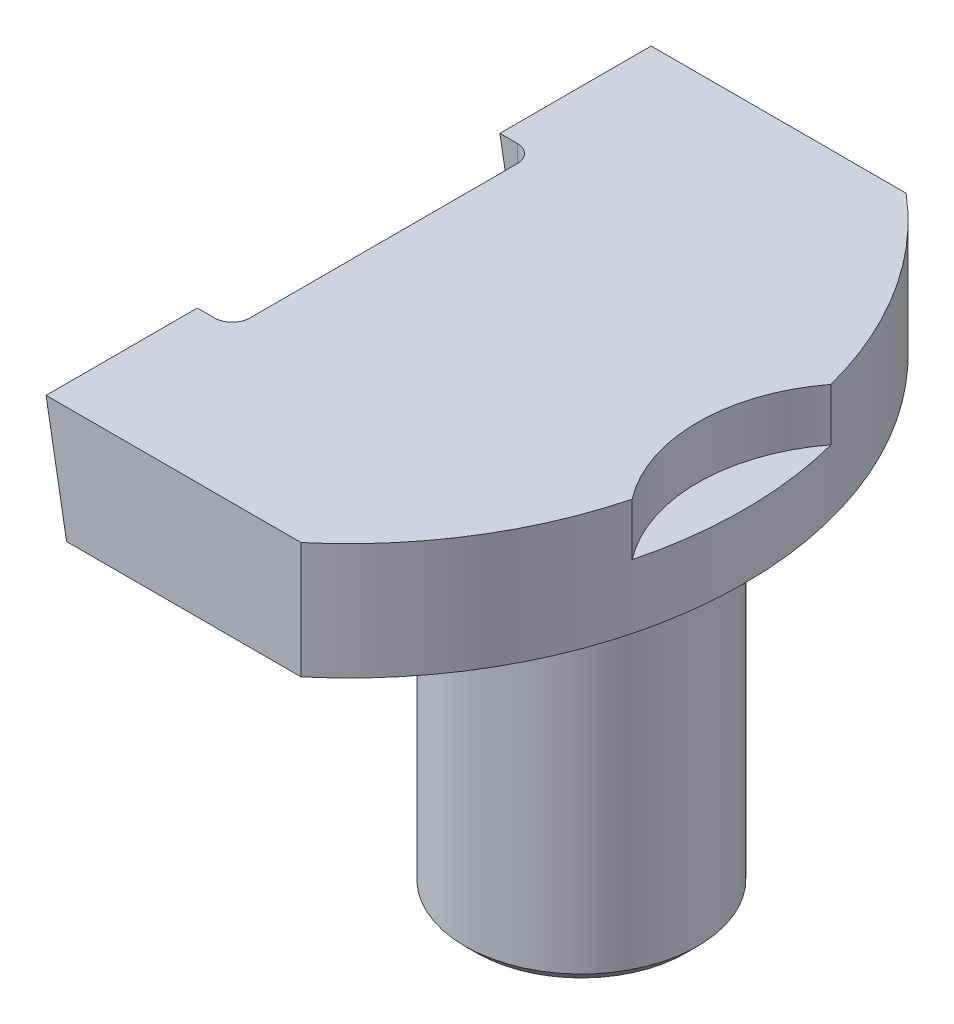
ISO-10303-21;
HEADER;
FILE_DESCRIPTION(('STEP AP214'),'2;1');
FILE_NAME('part.step','',(''),(''),'','','');
FILE_SCHEMA(('AUTOMOTIVE_DESIGN { 1 0 10303 214 1 1 1 1 }'));
ENDSEC;
DATA;
#1=APPLICATION_CONTEXT('core data for automotive mechanical design processes');
#2=APPLICATION_PROTOCOL_DEFINITION('international standard','automotive_design',2000,#1);
#3=PRODUCT_CONTEXT('',#1,'mechanical');
#4=PRODUCT('Part','Part','',(#3));
#5=PRODUCT_RELATED_PRODUCT_CATEGORY('part','',(#4));
#6=PRODUCT_DEFINITION_FORMATION('','',#4);
#7=PRODUCT_DEFINITION_CONTEXT('part definition',#1,'design');
#8=PRODUCT_DEFINITION('design','',#6,#7);
#9=PRODUCT_DEFINITION_SHAPE('','',#8);
#10=(LENGTH_UNIT() NAMED_UNIT(*) SI_UNIT(.MILLI.,.METRE.));
#11=(NAMED_UNIT(*) PLANE_ANGLE_UNIT() SI_UNIT($,.RADIAN.));
#12=(NAMED_UNIT(*) SI_UNIT($,.STERADIAN.) SOLID_ANGLE_UNIT());
#13=UNCERTAINTY_MEASURE_WITH_UNIT(LENGTH_MEASURE(1.E-05),#10,'distance_accuracy_value','');
#14=(GEOMETRIC_REPRESENTATION_CONTEXT(3) GLOBAL_UNCERTAINTY_ASSIGNED_CONTEXT((#13)) GLOBAL_UNIT_ASSIGNED_CONTEXT((#10,
#11,#12)) REPRESENTATION_CONTEXT('',''));
#15=CARTESIAN_POINT('',(0.,0.,0.));
#16=DIRECTION('',(0.,0.,1.));
#17=DIRECTION('',(1.,0.,0.));
#18=AXIS2_PLACEMENT_3D('',#15,#16,#17);
#19=CARTESIAN_POINT('',(0.,40.,0.));
#20=DIRECTION('',(0.,-1.,0.));
#21=DIRECTION('',(0.,0.,-1.));
#22=AXIS2_PLACEMENT_3D('',#19,#20,#21);
#23=CYLINDRICAL_SURFACE('',#22,10.);
#24=CARTESIAN_POINT('',(0.,28.,0.));
#25=DIRECTION('',(0.,-1.,0.));
#26=DIRECTION('',(0.,0.,-1.));
#27=AXIS2_PLACEMENT_3D('',#24,#25,#26);
#28=CIRCLE('',#27,10.);
#29=CARTESIAN_POINT('',(0.,28.,-10.));
#30=VERTEX_POINT('',#29);
#31=EDGE_CURVE('E148',#30,#30,#28,.T.);
#32=ORIENTED_EDGE('',*,*,#31,.T.);
#33=EDGE_LOOP('',(#32));
#34=FACE_BOUND('',#33,.T.);
#35=CARTESIAN_POINT('',(0.,1.,0.));
#36=DIRECTION('',(0.,1.,0.));
#37=DIRECTION('',(0.,0.,1.));
#38=AXIS2_PLACEMENT_3D('',#35,#36,#37);
#39=CIRCLE('',#38,10.);
#40=CARTESIAN_POINT('',(0.,1.,10.));
#41=VERTEX_POINT('',#40);
#42=EDGE_CURVE('E200',#41,#41,#39,.T.);
#43=ORIENTED_EDGE('',*,*,#42,.T.);
#44=EDGE_LOOP('',(#43));
#45=FACE_BOUND('',#44,.T.);
#46=ADVANCED_FACE('F42',(#34,#45),#23,.T.);
#47=CARTESIAN_POINT('',(0.,0.,0.));
#48=DIRECTION('',(0.,1.,0.));
#49=DIRECTION('',(0.,0.,1.));
#50=AXIS2_PLACEMENT_3D('',#47,#48,#49);
#51=PLANE('',#50);
#52=CARTESIAN_POINT('',(0.,0.,0.));
#53=DIRECTION('',(0.,1.,0.));
#54=DIRECTION('',(0.,0.,1.));
#55=AXIS2_PLACEMENT_3D('',#52,#53,#54);
#56=CIRCLE('',#55,9.);
#57=CARTESIAN_POINT('',(0.,0.,9.));
#58=VERTEX_POINT('',#57);
#59=EDGE_CURVE('E204',#58,#58,#56,.F.);
#60=ORIENTED_EDGE('',*,*,#59,.T.);
#61=EDGE_LOOP('',(#60));
#62=FACE_BOUND('',#61,.T.);
#63=ADVANCED_FACE('F287',(#62),#51,.F.);
#64=CARTESIAN_POINT('',(0.,1.,0.));
#65=DIRECTION('',(0.,1.,0.));
#66=DIRECTION('',(0.,0.,1.));
#67=AXIS2_PLACEMENT_3D('',#64,#65,#66);
#68=CONICAL_SURFACE('',#67,10.,0.785398163397449);
#69=ORIENTED_EDGE('',*,*,#59,.F.);
#70=EDGE_LOOP('',(#69));
#71=FACE_BOUND('',#70,.T.);
#72=ORIENTED_EDGE('',*,*,#42,.F.);
#73=EDGE_LOOP('',(#72));
#74=FACE_BOUND('',#73,.T.);
#75=ADVANCED_FACE('F294',(#71,#74),#68,.T.);
#76=CARTESIAN_POINT('',(-3.,28.,0.));
#77=DIRECTION('',(0.,-1.,0.));
#78=DIRECTION('',(0.,0.,-1.));
#79=AXIS2_PLACEMENT_3D('',#76,#77,#78);
#80=PLANE('',#79);
#81=CARTESIAN_POINT('',(0.,28.,0.));
#82=DIRECTION('',(0.,-1.,0.));
#83=DIRECTION('',(0.,0.,-1.));
#84=AXIS2_PLACEMENT_3D('',#81,#82,#83);
#85=CIRCLE('',#84,9.5);
#86=CARTESIAN_POINT('',(0.,28.,-9.5));
#87=VERTEX_POINT('',#86);
#88=EDGE_CURVE('E213',#87,#87,#85,.T.);
#89=ORIENTED_EDGE('',*,*,#88,.T.);
#90=EDGE_LOOP('',(#89));
#91=FACE_BOUND('',#90,.T.);
#92=ORIENTED_EDGE('',*,*,#31,.F.);
#93=EDGE_LOOP('',(#92));
#94=FACE_BOUND('',#93,.T.);
#95=ADVANCED_FACE('F264',(#91,#94),#80,.F.);
#96=CARTESIAN_POINT('',(0.,28.,0.));
#97=DIRECTION('',(0.,1.,0.));
#98=DIRECTION('',(0.,0.,1.));
#99=AXIS2_PLACEMENT_3D('',#96,#97,#98);
#100=CYLINDRICAL_SURFACE('',#99,9.5);
#101=ORIENTED_EDGE('',*,*,#88,.F.);
#102=EDGE_LOOP('',(#101));
#103=FACE_BOUND('',#102,.T.);
#104=CARTESIAN_POINT('',(0.,30.,0.));
#105=DIRECTION('',(0.,-1.,0.));
#106=DIRECTION('',(0.,0.,-1.));
#107=AXIS2_PLACEMENT_3D('',#104,#105,#106);
#108=CIRCLE('',#107,9.5);
#109=CARTESIAN_POINT('',(0.,30.,-9.5));
#110=VERTEX_POINT('',#109);
#111=EDGE_CURVE('E258',#110,#110,#108,.T.);
#112=ORIENTED_EDGE('',*,*,#111,.T.);
#113=EDGE_LOOP('',(#112));
#114=FACE_BOUND('',#113,.T.);
#115=ADVANCED_FACE('F267',(#103,#114),#100,.T.);
#116=CARTESIAN_POINT('',(24.,35.5,0.));
#117=DIRECTION('',(0.,1.,0.));
#118=DIRECTION('',(0.,0.,1.));
#119=AXIS2_PLACEMENT_3D('',#116,#117,#118);
#120=PLANE('',#119);
#121=CARTESIAN_POINT('',(24.,35.5,0.));
#122=DIRECTION('',(0.,1.,0.));
#123=DIRECTION('',(0.,0.,1.));
#124=AXIS2_PLACEMENT_3D('',#121,#122,#123);
#125=CIRCLE('',#124,14.);
#126=CARTESIAN_POINT('',(12.9090909090909,35.5,-8.54352009052418));
#127=VERTEX_POINT('',#126);
#128=CARTESIAN_POINT('',(12.9090909090909,35.5,8.54352009052418));
#129=VERTEX_POINT('',#128);
#130=EDGE_CURVE('E164',#127,#129,#125,.T.);
#131=ORIENTED_EDGE('',*,*,#130,.T.);
#132=CARTESIAN_POINT('',(-20.,35.5,0.));
#133=DIRECTION('',(0.,1.,0.));
#134=DIRECTION('',(0.,0.,1.));
#135=AXIS2_PLACEMENT_3D('',#132,#133,#134);
#136=CIRCLE('',#135,34.);
#137=EDGE_CURVE('E207',#127,#129,#136,.F.);
#138=ORIENTED_EDGE('',*,*,#137,.F.);
#139=EDGE_LOOP('',(#131,#138));
#140=FACE_BOUND('',#139,.T.);
#141=ADVANCED_FACE('F270',(#140),#120,.T.);
#142=CARTESIAN_POINT('',(24.,35.5,0.));
#143=DIRECTION('',(0.,1.,0.));
#144=DIRECTION('',(0.,0.,1.));
#145=AXIS2_PLACEMENT_3D('',#142,#143,#144);
#146=CYLINDRICAL_SURFACE('',#145,14.);
#147=DIRECTION('',(0.,1.,0.));
#148=VECTOR('',#147,1.);
#149=CARTESIAN_POINT('',(12.9090909090909,37.75,-8.54352009052418));
#150=LINE('',#149,#148);
#151=CARTESIAN_POINT('',(12.9090909090909,40.,-8.54352009052418));
#152=VERTEX_POINT('',#151);
#153=EDGE_CURVE('E170',#127,#152,#150,.T.);
#154=ORIENTED_EDGE('',*,*,#153,.T.);
#155=CARTESIAN_POINT('',(24.,40.,0.));
#156=DIRECTION('',(0.,1.,0.));
#157=DIRECTION('',(0.,0.,1.));
#158=AXIS2_PLACEMENT_3D('',#155,#156,#157);
#159=CIRCLE('',#158,14.);
#160=CARTESIAN_POINT('',(12.9090909090909,40.,8.54352009052418));
#161=VERTEX_POINT('',#160);
#162=EDGE_CURVE('E157',#152,#161,#159,.T.);
#163=ORIENTED_EDGE('',*,*,#162,.T.);
#164=DIRECTION('',(0.,1.,0.));
#165=VECTOR('',#164,1.);
#166=CARTESIAN_POINT('',(12.9090909090909,37.75,8.54352009052418));
#167=LINE('',#166,#165);
#168=EDGE_CURVE('E167',#161,#129,#167,.F.);
#169=ORIENTED_EDGE('',*,*,#168,.T.);
#170=ORIENTED_EDGE('',*,*,#130,.F.);
#171=EDGE_LOOP('',(#154,#163,#169,#170));
#172=FACE_BOUND('',#171,.T.);
#173=ADVANCED_FACE('F318',(#172),#146,.F.);
#174=CARTESIAN_POINT('',(0.,40.,0.));
#175=DIRECTION('',(0.,1.,0.));
#176=DIRECTION('',(0.,0.,1.));
#177=AXIS2_PLACEMENT_3D('',#174,#175,#176);
#178=PLANE('',#177);
#179=ORIENTED_EDGE('',*,*,#162,.F.);
#180=CARTESIAN_POINT('',(-20.,40.,0.));
#181=DIRECTION('',(0.,1.,0.));
#182=DIRECTION('',(0.,0.,-1.));
#183=AXIS2_PLACEMENT_3D('',#180,#181,#182);
#184=CIRCLE('',#183,34.);
#185=CARTESIAN_POINT('',(1.90890230020665,40.,-26.));
#186=VERTEX_POINT('',#185);
#187=EDGE_CURVE('E192',#152,#186,#184,.T.);
#188=ORIENTED_EDGE('',*,*,#187,.T.);
#189=DIRECTION('',(-1.,0.,0.));
#190=VECTOR('',#189,1.);
#191=CARTESIAN_POINT('',(-20.,40.,-26.));
#192=LINE('',#191,#190);
#193=CARTESIAN_POINT('',(-20.,40.,-26.));
#194=VERTEX_POINT('',#193);
#195=EDGE_CURVE('E196',#186,#194,#192,.T.);
#196=ORIENTED_EDGE('',*,*,#195,.T.);
#197=DIRECTION('',(0.,0.,1.));
#198=VECTOR('',#197,1.);
#199=CARTESIAN_POINT('',(-20.,40.,-13.));
#200=LINE('',#199,#198);
#201=CARTESIAN_POINT('',(-20.,40.,-13.));
#202=VERTEX_POINT('',#201);
#203=EDGE_CURVE('E153',#194,#202,#200,.T.);
#204=ORIENTED_EDGE('',*,*,#203,.T.);
#205=DIRECTION('',(1.,0.,0.));
#206=VECTOR('',#205,1.);
#207=CARTESIAN_POINT('',(-17.,40.,-13.));
#208=LINE('',#207,#206);
#209=CARTESIAN_POINT('',(-18.5,40.,-13.));
#210=VERTEX_POINT('',#209);
#211=EDGE_CURVE('E172',#202,#210,#208,.T.);
#212=ORIENTED_EDGE('',*,*,#211,.T.);
#213=CARTESIAN_POINT('',(-18.5,40.,-11.5));
#214=DIRECTION('',(0.,1.,0.));
#215=DIRECTION('',(0.,0.,1.));
#216=AXIS2_PLACEMENT_3D('',#213,#214,#215);
#217=CIRCLE('',#216,1.5);
#218=CARTESIAN_POINT('',(-17.,40.,-11.5));
#219=VERTEX_POINT('',#218);
#220=EDGE_CURVE('E229',#210,#219,#217,.F.);
#221=ORIENTED_EDGE('',*,*,#220,.T.);
#222=DIRECTION('',(0.,0.,1.));
#223=VECTOR('',#222,1.);
#224=CARTESIAN_POINT('',(-17.,40.,13.));
#225=LINE('',#224,#223);
#226=CARTESIAN_POINT('',(-17.,40.,11.5));
#227=VERTEX_POINT('',#226);
#228=EDGE_CURVE('E181',#219,#227,#225,.T.);
#229=ORIENTED_EDGE('',*,*,#228,.T.);
#230=CARTESIAN_POINT('',(-18.5,40.,11.5));
#231=DIRECTION('',(0.,1.,0.));
#232=DIRECTION('',(0.,0.,1.));
#233=AXIS2_PLACEMENT_3D('',#230,#231,#232);
#234=CIRCLE('',#233,1.5);
#235=CARTESIAN_POINT('',(-18.5,40.,13.));
#236=VERTEX_POINT('',#235);
#237=EDGE_CURVE('E223',#227,#236,#234,.F.);
#238=ORIENTED_EDGE('',*,*,#237,.T.);
#239=DIRECTION('',(-1.,0.,0.));
#240=VECTOR('',#239,1.);
#241=CARTESIAN_POINT('',(-17.,40.,13.));
#242=LINE('',#241,#240);
#243=CARTESIAN_POINT('',(-20.,40.,13.));
#244=VERTEX_POINT('',#243);
#245=EDGE_CURVE('E184',#236,#244,#242,.T.);
#246=ORIENTED_EDGE('',*,*,#245,.T.);
#247=DIRECTION('',(0.,0.,1.));
#248=VECTOR('',#247,1.);
#249=CARTESIAN_POINT('',(-20.,40.,13.));
#250=LINE('',#249,#248);
#251=CARTESIAN_POINT('',(-20.,40.,26.));
#252=VERTEX_POINT('',#251);
#253=EDGE_CURVE('E186',#244,#252,#250,.T.);
#254=ORIENTED_EDGE('',*,*,#253,.T.);
#255=DIRECTION('',(1.,0.,0.));
#256=VECTOR('',#255,1.);
#257=CARTESIAN_POINT('',(-20.,40.,26.));
#258=LINE('',#257,#256);
#259=CARTESIAN_POINT('',(1.90890230020665,40.,26.));
#260=VERTEX_POINT('',#259);
#261=EDGE_CURVE('E189',#252,#260,#258,.T.);
#262=ORIENTED_EDGE('',*,*,#261,.T.);
#263=EDGE_CURVE('E193',#260,#161,#184,.T.);
#264=ORIENTED_EDGE('',*,*,#263,.T.);
#265=EDGE_LOOP('',(#179,#188,#196,#204,#212,#221,#229,#238,#246,#254,#262,#264));
#266=FACE_BOUND('',#265,.T.);
#267=ADVANCED_FACE('F233',(#266),#178,.T.);
#268=CARTESIAN_POINT('',(-20.,30.,0.));
#269=DIRECTION('',(0.,1.,0.));
#270=DIRECTION('',(0.,0.,1.));
#271=AXIS2_PLACEMENT_3D('',#268,#269,#270);
#272=CYLINDRICAL_SURFACE('',#271,34.);
#273=ORIENTED_EDGE('',*,*,#153,.F.);
#274=ORIENTED_EDGE('',*,*,#137,.T.);
#275=ORIENTED_EDGE('',*,*,#168,.F.);
#276=ORIENTED_EDGE('',*,*,#263,.F.);
#277=DIRECTION('',(0.,1.,0.));
#278=VECTOR('',#277,1.);
#279=CARTESIAN_POINT('',(1.90890230020665,30.,26.));
#280=LINE('',#279,#278);
#281=CARTESIAN_POINT('',(1.90890230020665,30.,26.));
#282=VERTEX_POINT('',#281);
#283=EDGE_CURVE('E140',#282,#260,#280,.T.);
#284=ORIENTED_EDGE('',*,*,#283,.F.);
#285=CARTESIAN_POINT('',(-20.,30.,0.));
#286=DIRECTION('',(0.,1.,0.));
#287=DIRECTION('',(0.,0.,-1.));
#288=AXIS2_PLACEMENT_3D('',#285,#286,#287);
#289=CIRCLE('',#288,34.);
#290=CARTESIAN_POINT('',(1.90890230020665,30.,-26.));
#291=VERTEX_POINT('',#290);
#292=EDGE_CURVE('E141',#282,#291,#289,.T.);
#293=ORIENTED_EDGE('',*,*,#292,.T.);
#294=DIRECTION('',(0.,1.,0.));
#295=VECTOR('',#294,1.);
#296=CARTESIAN_POINT('',(1.90890230020665,30.,-26.));
#297=LINE('',#296,#295);
#298=EDGE_CURVE('E137',#291,#186,#297,.T.);
#299=ORIENTED_EDGE('',*,*,#298,.T.);
#300=ORIENTED_EDGE('',*,*,#187,.F.);
#301=EDGE_LOOP('',(#273,#274,#275,#276,#284,#293,#299,#300));
#302=FACE_BOUND('',#301,.T.);
#303=ADVANCED_FACE('F247',(#302),#272,.T.);
#304=CARTESIAN_POINT('',(-20.,30.,-26.));
#305=DIRECTION('',(0.,0.,-1.));
#306=DIRECTION('',(-1.,0.,0.));
#307=AXIS2_PLACEMENT_3D('',#304,#305,#306);
#308=PLANE('',#307);
#309=DIRECTION('',(0.173648177666924,-0.984807753012209,0.));
#310=VECTOR('',#309,1.);
#311=CARTESIAN_POINT('',(-18.2898992833717,30.3015368960704,-26.));
#312=LINE('',#311,#310);
#313=CARTESIAN_POINT('',(-18.2367301929154,30.,-26.));
#314=VERTEX_POINT('',#313);
#315=EDGE_CURVE('E134',#194,#314,#312,.T.);
#316=ORIENTED_EDGE('',*,*,#315,.F.);
#317=ORIENTED_EDGE('',*,*,#195,.F.);
#318=ORIENTED_EDGE('',*,*,#298,.F.);
#319=DIRECTION('',(-1.,0.,0.));
#320=VECTOR('',#319,1.);
#321=CARTESIAN_POINT('',(-20.,30.,-26.));
#322=LINE('',#321,#320);
#323=EDGE_CURVE('E131',#291,#314,#322,.T.);
#324=ORIENTED_EDGE('',*,*,#323,.T.);
#325=EDGE_LOOP('',(#316,#317,#318,#324));
#326=FACE_BOUND('',#325,.T.);
#327=ADVANCED_FACE('F132',(#326),#308,.T.);
#328=CARTESIAN_POINT('',(-20.,40.,163.364766009556));
#329=DIRECTION('',(0.984807753012209,0.173648177666924,0.));
#330=DIRECTION('',(-0.173648177666924,0.984807753012209,0.));
#331=AXIS2_PLACEMENT_3D('',#328,#329,#330);
#332=PLANE('',#331);
#333=DIRECTION('',(0.,0.,-1.));
#334=VECTOR('',#333,1.);
#335=CARTESIAN_POINT('',(-18.2367301929154,30.,163.364766009556));
#336=LINE('',#335,#334);
#337=CARTESIAN_POINT('',(-18.2367301929154,30.,-12.97671561537));
#338=VERTEX_POINT('',#337);
#339=EDGE_CURVE('E56',#338,#314,#336,.T.);
#340=ORIENTED_EDGE('',*,*,#339,.F.);
#341=CARTESIAN_POINT('',(-18.5,31.4930772705731,-11.5));
#342=DIRECTION('',(0.984807753012209,0.173648177666924,0.));
#343=DIRECTION('',(0.173648177666924,-0.984807753012209,0.));
#344=AXIS2_PLACEMENT_3D('',#341,#342,#343);
#345=ELLIPSE('',#344,8.63815572471578,1.5);
#346=CARTESIAN_POINT('',(-18.5,31.4930772705731,-13.));
#347=VERTEX_POINT('',#346);
#348=EDGE_CURVE('E12',#338,#347,#345,.T.);
#349=ORIENTED_EDGE('',*,*,#348,.T.);
#350=DIRECTION('',(-0.173648177666924,0.984807753012209,0.));
#351=VECTOR('',#350,1.);
#352=CARTESIAN_POINT('',(-18.1994382145506,29.788506681082,-13.));
#353=LINE('',#352,#351);
#354=EDGE_CURVE('E154',#347,#202,#353,.T.);
#355=ORIENTED_EDGE('',*,*,#354,.T.);
#356=ORIENTED_EDGE('',*,*,#203,.F.);
#357=ORIENTED_EDGE('',*,*,#315,.T.);
#358=EDGE_LOOP('',(#340,#349,#355,#356,#357));
#359=FACE_BOUND('',#358,.T.);
#360=ADVANCED_FACE('F151',(#359),#332,.F.);
#361=CARTESIAN_POINT('',(-17.,30.,-13.));
#362=DIRECTION('',(0.,0.,1.));
#363=DIRECTION('',(1.,0.,0.));
#364=AXIS2_PLACEMENT_3D('',#361,#362,#363);
#365=PLANE('',#364);
#366=ORIENTED_EDGE('',*,*,#354,.F.);
#367=DIRECTION('',(0.,1.,0.));
#368=VECTOR('',#367,1.);
#369=CARTESIAN_POINT('',(-18.5,40.,-13.));
#370=LINE('',#369,#368);
#371=EDGE_CURVE('E220',#347,#210,#370,.T.);
#372=ORIENTED_EDGE('',*,*,#371,.T.);
#373=ORIENTED_EDGE('',*,*,#211,.F.);
#374=EDGE_LOOP('',(#366,#372,#373));
#375=FACE_BOUND('',#374,.T.);
#376=ADVANCED_FACE('F243',(#375),#365,.T.);
#377=CARTESIAN_POINT('',(-17.,30.,13.));
#378=DIRECTION('',(-1.,0.,0.));
#379=DIRECTION('',(0.,0.,1.));
#380=AXIS2_PLACEMENT_3D('',#377,#378,#379);
#381=PLANE('',#380);
#382=DIRECTION('',(0.,0.,1.));
#383=VECTOR('',#382,1.);
#384=CARTESIAN_POINT('',(-17.,30.,13.));
#385=LINE('',#384,#383);
#386=CARTESIAN_POINT('',(-17.,30.,-11.5));
#387=VERTEX_POINT('',#386);
#388=CARTESIAN_POINT('',(-17.,30.,11.5));
#389=VERTEX_POINT('',#388);
#390=EDGE_CURVE('E173',#387,#389,#385,.T.);
#391=ORIENTED_EDGE('',*,*,#390,.T.);
#392=DIRECTION('',(0.,1.,0.));
#393=VECTOR('',#392,1.);
#394=CARTESIAN_POINT('',(-17.,40.,11.5));
#395=LINE('',#394,#393);
#396=EDGE_CURVE('E215',#389,#227,#395,.T.);
#397=ORIENTED_EDGE('',*,*,#396,.T.);
#398=ORIENTED_EDGE('',*,*,#228,.F.);
#399=DIRECTION('',(0.,1.,0.));
#400=VECTOR('',#399,1.);
#401=CARTESIAN_POINT('',(-17.,30.,-11.5));
#402=LINE('',#401,#400);
#403=EDGE_CURVE('E210',#219,#387,#402,.F.);
#404=ORIENTED_EDGE('',*,*,#403,.T.);
#405=EDGE_LOOP('',(#391,#397,#398,#404));
#406=FACE_BOUND('',#405,.T.);
#407=ADVANCED_FACE('F239',(#406),#381,.T.);
#408=CARTESIAN_POINT('',(-17.,30.,13.));
#409=DIRECTION('',(0.,0.,-1.));
#410=DIRECTION('',(-1.,0.,0.));
#411=AXIS2_PLACEMENT_3D('',#408,#409,#410);
#412=PLANE('',#411);
#413=ORIENTED_EDGE('',*,*,#245,.F.);
#414=DIRECTION('',(0.,1.,0.));
#415=VECTOR('',#414,1.);
#416=CARTESIAN_POINT('',(-18.5,30.,13.));
#417=LINE('',#416,#415);
#418=CARTESIAN_POINT('',(-18.5,31.4930772705731,13.));
#419=VERTEX_POINT('',#418);
#420=EDGE_CURVE('E218',#236,#419,#417,.F.);
#421=ORIENTED_EDGE('',*,*,#420,.T.);
#422=DIRECTION('',(0.173648177666924,-0.984807753012209,0.));
#423=VECTOR('',#422,1.);
#424=CARTESIAN_POINT('',(-18.1994382145506,29.788506681082,13.));
#425=LINE('',#424,#423);
#426=EDGE_CURVE('E160',#244,#419,#425,.T.);
#427=ORIENTED_EDGE('',*,*,#426,.F.);
#428=EDGE_LOOP('',(#413,#421,#427));
#429=FACE_BOUND('',#428,.T.);
#430=ADVANCED_FACE('F316',(#429),#412,.T.);
#431=CARTESIAN_POINT('',(-18.2367301929154,30.,26.));
#432=VERTEX_POINT('',#431);
#433=CARTESIAN_POINT('',(-18.2367301929154,30.,12.97671561537));
#434=VERTEX_POINT('',#433);
#435=EDGE_CURVE('E64',#432,#434,#336,.T.);
#436=ORIENTED_EDGE('',*,*,#435,.F.);
#437=DIRECTION('',(-0.173648177666924,0.984807753012209,0.));
#438=VECTOR('',#437,1.);
#439=CARTESIAN_POINT('',(-18.2898992833717,30.3015368960704,26.));
#440=LINE('',#439,#438);
#441=EDGE_CURVE('E155',#432,#252,#440,.T.);
#442=ORIENTED_EDGE('',*,*,#441,.T.);
#443=ORIENTED_EDGE('',*,*,#253,.F.);
#444=ORIENTED_EDGE('',*,*,#426,.T.);
#445=CARTESIAN_POINT('',(-18.5,31.4930772705731,11.5));
#446=DIRECTION('',(0.984807753012209,0.173648177666924,0.));
#447=DIRECTION('',(0.173648177666924,-0.984807753012209,0.));
#448=AXIS2_PLACEMENT_3D('',#445,#446,#447);
#449=ELLIPSE('',#448,8.63815572471578,1.5);
#450=EDGE_CURVE('E225',#419,#434,#449,.T.);
#451=ORIENTED_EDGE('',*,*,#450,.T.);
#452=EDGE_LOOP('',(#436,#442,#443,#444,#451));
#453=FACE_BOUND('',#452,.T.);
#454=ADVANCED_FACE('F252',(#453),#332,.F.);
#455=CARTESIAN_POINT('',(-20.,30.,26.));
#456=DIRECTION('',(0.,0.,1.));
#457=DIRECTION('',(1.,0.,0.));
#458=AXIS2_PLACEMENT_3D('',#455,#456,#457);
#459=PLANE('',#458);
#460=ORIENTED_EDGE('',*,*,#441,.F.);
#461=DIRECTION('',(1.,0.,0.));
#462=VECTOR('',#461,1.);
#463=CARTESIAN_POINT('',(-20.,30.,26.));
#464=LINE('',#463,#462);
#465=EDGE_CURVE('E176',#432,#282,#464,.T.);
#466=ORIENTED_EDGE('',*,*,#465,.T.);
#467=ORIENTED_EDGE('',*,*,#283,.T.);
#468=ORIENTED_EDGE('',*,*,#261,.F.);
#469=EDGE_LOOP('',(#460,#466,#467,#468));
#470=FACE_BOUND('',#469,.T.);
#471=ADVANCED_FACE('F275',(#470),#459,.T.);
#472=CARTESIAN_POINT('',(-20.,30.,0.));
#473=DIRECTION('',(0.,-1.,0.));
#474=DIRECTION('',(0.,0.,-1.));
#475=AXIS2_PLACEMENT_3D('',#472,#473,#474);
#476=PLANE('',#475);
#477=ORIENTED_EDGE('',*,*,#465,.F.);
#478=ORIENTED_EDGE('',*,*,#435,.T.);
#479=CARTESIAN_POINT('',(-18.5,30.,11.5));
#480=DIRECTION('',(0.,-1.,0.));
#481=DIRECTION('',(0.,0.,-1.));
#482=AXIS2_PLACEMENT_3D('',#479,#480,#481);
#483=CIRCLE('',#482,1.5);
#484=EDGE_CURVE('E227',#434,#389,#483,.F.);
#485=ORIENTED_EDGE('',*,*,#484,.T.);
#486=ORIENTED_EDGE('',*,*,#390,.F.);
#487=CARTESIAN_POINT('',(-18.5,30.,-11.5));
#488=DIRECTION('',(0.,-1.,0.));
#489=DIRECTION('',(0.,0.,-1.));
#490=AXIS2_PLACEMENT_3D('',#487,#488,#489);
#491=CIRCLE('',#490,1.5);
#492=EDGE_CURVE('E50',#387,#338,#491,.F.);
#493=ORIENTED_EDGE('',*,*,#492,.T.);
#494=ORIENTED_EDGE('',*,*,#339,.T.);
#495=ORIENTED_EDGE('',*,*,#323,.F.);
#496=ORIENTED_EDGE('',*,*,#292,.F.);
#497=EDGE_LOOP('',(#477,#478,#485,#486,#493,#494,#495,#496));
#498=FACE_BOUND('',#497,.T.);
#499=ORIENTED_EDGE('',*,*,#111,.F.);
#500=EDGE_LOOP('',(#499));
#501=FACE_BOUND('',#500,.T.);
#502=ADVANCED_FACE('F143',(#498,#501),#476,.T.);
#503=CARTESIAN_POINT('',(-18.5,30.,11.5));
#504=DIRECTION('',(0.,-1.,0.));
#505=DIRECTION('',(0.,0.,-1.));
#506=AXIS2_PLACEMENT_3D('',#503,#504,#505);
#507=CYLINDRICAL_SURFACE('',#506,1.5);
#508=ORIENTED_EDGE('',*,*,#450,.F.);
#509=ORIENTED_EDGE('',*,*,#420,.F.);
#510=ORIENTED_EDGE('',*,*,#237,.F.);
#511=ORIENTED_EDGE('',*,*,#396,.F.);
#512=ORIENTED_EDGE('',*,*,#484,.F.);
#513=EDGE_LOOP('',(#508,#509,#510,#511,#512));
#514=FACE_BOUND('',#513,.T.);
#515=ADVANCED_FACE('F274',(#514),#507,.F.);
#516=CARTESIAN_POINT('',(-18.5,30.,-11.5));
#517=DIRECTION('',(0.,-1.,0.));
#518=DIRECTION('',(0.,0.,-1.));
#519=AXIS2_PLACEMENT_3D('',#516,#517,#518);
#520=CYLINDRICAL_SURFACE('',#519,1.5);
#521=ORIENTED_EDGE('',*,*,#492,.F.);
#522=ORIENTED_EDGE('',*,*,#403,.F.);
#523=ORIENTED_EDGE('',*,*,#220,.F.);
#524=ORIENTED_EDGE('',*,*,#371,.F.);
#525=ORIENTED_EDGE('',*,*,#348,.F.);
#526=EDGE_LOOP('',(#521,#522,#523,#524,#525));
#527=FACE_BOUND('',#526,.T.);
#528=ADVANCED_FACE('F44',(#527),#520,.F.);
#529=CLOSED_SHELL('',(#46,#63,#75,#95,#115,#141,#173,#267,#303,#327,#360,#376,#407,#430,#454,
#471,#502,#515,#528));
#530=MANIFOLD_SOLID_BREP('B2',#529);
#531=ADVANCED_BREP_SHAPE_REPRESENTATION('',(#18,#530),#14);
#532=SHAPE_DEFINITION_REPRESENTATION(#9,#531);
ENDSEC;
END-ISO-10303-21;
